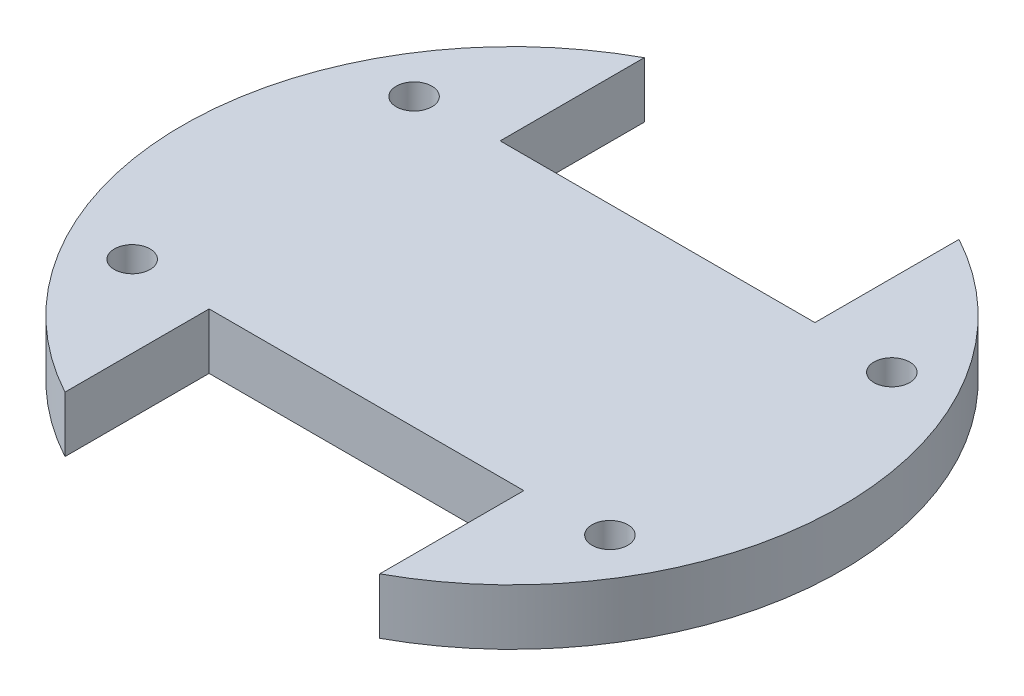
ISO-10303-21;
HEADER;
FILE_DESCRIPTION(('STEP AP214'),'2;1');
FILE_NAME('part.step','',(''),(''),'','','');
FILE_SCHEMA(('AUTOMOTIVE_DESIGN { 1 0 10303 214 1 1 1 1 }'));
ENDSEC;
DATA;
#1=APPLICATION_CONTEXT('core data for automotive mechanical design processes');
#2=APPLICATION_PROTOCOL_DEFINITION('international standard','automotive_design',2000,#1);
#3=PRODUCT_CONTEXT('',#1,'mechanical');
#4=PRODUCT('Part','Part','',(#3));
#5=PRODUCT_RELATED_PRODUCT_CATEGORY('part','',(#4));
#6=PRODUCT_DEFINITION_FORMATION('','',#4);
#7=PRODUCT_DEFINITION_CONTEXT('part definition',#1,'design');
#8=PRODUCT_DEFINITION('design','',#6,#7);
#9=PRODUCT_DEFINITION_SHAPE('','',#8);
#10=(LENGTH_UNIT() NAMED_UNIT(*) SI_UNIT(.MILLI.,.METRE.));
#11=(NAMED_UNIT(*) PLANE_ANGLE_UNIT() SI_UNIT($,.RADIAN.));
#12=(NAMED_UNIT(*) SI_UNIT($,.STERADIAN.) SOLID_ANGLE_UNIT());
#13=UNCERTAINTY_MEASURE_WITH_UNIT(LENGTH_MEASURE(1.E-05),#10,'distance_accuracy_value','');
#14=(GEOMETRIC_REPRESENTATION_CONTEXT(3) GLOBAL_UNCERTAINTY_ASSIGNED_CONTEXT((#13)) GLOBAL_UNIT_ASSIGNED_CONTEXT((#10,
#11,#12)) REPRESENTATION_CONTEXT('',''));
#15=CARTESIAN_POINT('',(0.,0.,0.));
#16=DIRECTION('',(0.,0.,1.));
#17=DIRECTION('',(1.,0.,0.));
#18=AXIS2_PLACEMENT_3D('',#15,#16,#17);
#19=CARTESIAN_POINT('',(0.,5.,0.));
#20=DIRECTION('',(0.,-1.,0.));
#21=DIRECTION('',(0.,0.,-1.));
#22=AXIS2_PLACEMENT_3D('',#19,#20,#21);
#23=CYLINDRICAL_SURFACE('',#22,29.5);
#24=CARTESIAN_POINT('',(0.,0.,0.));
#25=DIRECTION('',(0.,1.,0.));
#26=DIRECTION('',(0.,0.,1.));
#27=AXIS2_PLACEMENT_3D('',#24,#25,#26);
#28=CIRCLE('',#27,29.5);
#29=CARTESIAN_POINT('',(14.0831265655498,0.,25.9213338032345));
#30=VERTEX_POINT('',#29);
#31=CARTESIAN_POINT('',(14.0831265655494,0.,-25.9213338032347));
#32=VERTEX_POINT('',#31);
#33=EDGE_CURVE('E166',#30,#32,#28,.T.);
#34=ORIENTED_EDGE('',*,*,#33,.T.);
#35=DIRECTION('',(0.,-1.,0.));
#36=VECTOR('',#35,1.);
#37=CARTESIAN_POINT('',(14.0831265655494,5.,-25.9213338032347));
#38=LINE('',#37,#36);
#39=CARTESIAN_POINT('',(14.0831265655494,5.,-25.9213338032347));
#40=VERTEX_POINT('',#39);
#41=EDGE_CURVE('E120',#32,#40,#38,.F.);
#42=ORIENTED_EDGE('',*,*,#41,.T.);
#43=CARTESIAN_POINT('',(0.,5.,0.));
#44=DIRECTION('',(0.,1.,0.));
#45=DIRECTION('',(0.,0.,1.));
#46=AXIS2_PLACEMENT_3D('',#43,#44,#45);
#47=CIRCLE('',#46,29.5);
#48=CARTESIAN_POINT('',(14.0831265655498,5.,25.9213338032345));
#49=VERTEX_POINT('',#48);
#50=EDGE_CURVE('E162',#49,#40,#47,.T.);
#51=ORIENTED_EDGE('',*,*,#50,.F.);
#52=DIRECTION('',(0.,-1.,0.));
#53=VECTOR('',#52,1.);
#54=CARTESIAN_POINT('',(14.0831265655498,5.,25.9213338032345));
#55=LINE('',#54,#53);
#56=EDGE_CURVE('E113',#49,#30,#55,.T.);
#57=ORIENTED_EDGE('',*,*,#56,.T.);
#58=EDGE_LOOP('',(#34,#42,#51,#57));
#59=FACE_BOUND('',#58,.T.);
#60=ADVANCED_FACE('F41',(#59),#23,.T.);
#61=CARTESIAN_POINT('',(-14.0831265655494,5.,-25.9213338032347));
#62=VERTEX_POINT('',#61);
#63=CARTESIAN_POINT('',(-14.083126565549,5.,25.9213338032349));
#64=VERTEX_POINT('',#63);
#65=EDGE_CURVE('E165',#62,#64,#47,.T.);
#66=ORIENTED_EDGE('',*,*,#65,.F.);
#67=DIRECTION('',(0.,-1.,0.));
#68=VECTOR('',#67,1.);
#69=CARTESIAN_POINT('',(-14.0831265655494,5.,-25.9213338032347));
#70=LINE('',#69,#68);
#71=CARTESIAN_POINT('',(-14.0831265655494,0.,-25.9213338032347));
#72=VERTEX_POINT('',#71);
#73=EDGE_CURVE('E157',#62,#72,#70,.T.);
#74=ORIENTED_EDGE('',*,*,#73,.T.);
#75=CARTESIAN_POINT('',(-14.083126565549,0.,25.9213338032349));
#76=VERTEX_POINT('',#75);
#77=EDGE_CURVE('E161',#72,#76,#28,.T.);
#78=ORIENTED_EDGE('',*,*,#77,.T.);
#79=DIRECTION('',(0.,-1.,0.));
#80=VECTOR('',#79,1.);
#81=CARTESIAN_POINT('',(-14.083126565549,5.,25.9213338032349));
#82=LINE('',#81,#80);
#83=EDGE_CURVE('E154',#76,#64,#82,.F.);
#84=ORIENTED_EDGE('',*,*,#83,.T.);
#85=EDGE_LOOP('',(#66,#74,#78,#84));
#86=FACE_BOUND('',#85,.T.);
#87=ADVANCED_FACE('F43',(#86),#23,.T.);
#88=CARTESIAN_POINT('',(0.,5.,0.));
#89=DIRECTION('',(0.,1.,0.));
#90=DIRECTION('',(0.,0.,1.));
#91=AXIS2_PLACEMENT_3D('',#88,#89,#90);
#92=PLANE('',#91);
#93=CARTESIAN_POINT('',(21.376,5.,12.613));
#94=DIRECTION('',(0.,1.,0.));
#95=DIRECTION('',(0.,0.,1.));
#96=AXIS2_PLACEMENT_3D('',#93,#94,#95);
#97=CIRCLE('',#96,1.6);
#98=CARTESIAN_POINT('',(21.376,5.,14.213));
#99=VERTEX_POINT('',#98);
#100=EDGE_CURVE('E290',#99,#99,#97,.T.);
#101=ORIENTED_EDGE('',*,*,#100,.F.);
#102=EDGE_LOOP('',(#101));
#103=FACE_BOUND('',#102,.T.);
#104=CARTESIAN_POINT('',(-21.376,5.,12.613));
#105=DIRECTION('',(0.,1.,0.));
#106=DIRECTION('',(0.,0.,1.));
#107=AXIS2_PLACEMENT_3D('',#104,#105,#106);
#108=CIRCLE('',#107,1.6);
#109=CARTESIAN_POINT('',(-21.376,5.,14.213));
#110=VERTEX_POINT('',#109);
#111=EDGE_CURVE('E294',#110,#110,#108,.T.);
#112=ORIENTED_EDGE('',*,*,#111,.F.);
#113=EDGE_LOOP('',(#112));
#114=FACE_BOUND('',#113,.T.);
#115=CARTESIAN_POINT('',(-21.376,5.,-12.613));
#116=DIRECTION('',(0.,1.,0.));
#117=DIRECTION('',(0.,0.,1.));
#118=AXIS2_PLACEMENT_3D('',#115,#116,#117);
#119=CIRCLE('',#118,1.6);
#120=CARTESIAN_POINT('',(-21.376,5.,-11.013));
#121=VERTEX_POINT('',#120);
#122=EDGE_CURVE('E302',#121,#121,#119,.T.);
#123=ORIENTED_EDGE('',*,*,#122,.F.);
#124=EDGE_LOOP('',(#123));
#125=FACE_BOUND('',#124,.T.);
#126=CARTESIAN_POINT('',(21.376,5.,-12.613));
#127=DIRECTION('',(0.,1.,0.));
#128=DIRECTION('',(0.,0.,1.));
#129=AXIS2_PLACEMENT_3D('',#126,#127,#128);
#130=CIRCLE('',#129,1.6);
#131=CARTESIAN_POINT('',(21.376,5.,-11.013));
#132=VERTEX_POINT('',#131);
#133=EDGE_CURVE('E300',#132,#132,#130,.T.);
#134=ORIENTED_EDGE('',*,*,#133,.F.);
#135=EDGE_LOOP('',(#134));
#136=FACE_BOUND('',#135,.T.);
#137=DIRECTION('',(0.,0.,-1.));
#138=VECTOR('',#137,1.);
#139=CARTESIAN_POINT('',(14.0831265655494,5.,-13.0230256450114));
#140=LINE('',#139,#138);
#141=CARTESIAN_POINT('',(14.0831265655494,5.,-13.0230256450114));
#142=VERTEX_POINT('',#141);
#143=EDGE_CURVE('E131',#142,#40,#140,.T.);
#144=ORIENTED_EDGE('',*,*,#143,.F.);
#145=DIRECTION('',(1.,0.,0.));
#146=VECTOR('',#145,1.);
#147=CARTESIAN_POINT('',(-14.0831265655494,5.,-13.0230256450114));
#148=LINE('',#147,#146);
#149=CARTESIAN_POINT('',(-14.0831265655494,5.,-13.0230256450114));
#150=VERTEX_POINT('',#149);
#151=EDGE_CURVE('E110',#150,#142,#148,.T.);
#152=ORIENTED_EDGE('',*,*,#151,.F.);
#153=DIRECTION('',(0.,0.,1.));
#154=VECTOR('',#153,1.);
#155=CARTESIAN_POINT('',(-14.0831265655494,5.,-13.0230256450114));
#156=LINE('',#155,#154);
#157=EDGE_CURVE('E133',#62,#150,#156,.T.);
#158=ORIENTED_EDGE('',*,*,#157,.F.);
#159=ORIENTED_EDGE('',*,*,#65,.T.);
#160=DIRECTION('',(0.,0.,1.));
#161=VECTOR('',#160,1.);
#162=CARTESIAN_POINT('',(-14.0831265655486,5.,13.0230256450114));
#163=LINE('',#162,#161);
#164=CARTESIAN_POINT('',(-14.0831265655486,5.,13.0230256450114));
#165=VERTEX_POINT('',#164);
#166=EDGE_CURVE('E143',#165,#64,#163,.T.);
#167=ORIENTED_EDGE('',*,*,#166,.F.);
#168=DIRECTION('',(-1.,0.,0.));
#169=VECTOR('',#168,1.);
#170=CARTESIAN_POINT('',(14.0831265655501,5.,13.0230256450114));
#171=LINE('',#170,#169);
#172=CARTESIAN_POINT('',(14.0831265655501,5.,13.0230256450114));
#173=VERTEX_POINT('',#172);
#174=EDGE_CURVE('E145',#173,#165,#171,.T.);
#175=ORIENTED_EDGE('',*,*,#174,.F.);
#176=DIRECTION('',(0.,0.,-1.));
#177=VECTOR('',#176,1.);
#178=CARTESIAN_POINT('',(14.0831265655501,5.,13.0230256450114));
#179=LINE('',#178,#177);
#180=EDGE_CURVE('E134',#49,#173,#179,.T.);
#181=ORIENTED_EDGE('',*,*,#180,.F.);
#182=ORIENTED_EDGE('',*,*,#50,.T.);
#183=EDGE_LOOP('',(#144,#152,#158,#159,#167,#175,#181,#182));
#184=FACE_BOUND('',#183,.T.);
#185=ADVANCED_FACE('F174',(#103,#114,#125,#136,#184),#92,.T.);
#186=CARTESIAN_POINT('',(0.,0.,0.));
#187=DIRECTION('',(0.,1.,0.));
#188=DIRECTION('',(0.,0.,1.));
#189=AXIS2_PLACEMENT_3D('',#186,#187,#188);
#190=PLANE('',#189);
#191=CARTESIAN_POINT('',(21.376,0.,12.613));
#192=DIRECTION('',(0.,1.,0.));
#193=DIRECTION('',(0.,0.,1.));
#194=AXIS2_PLACEMENT_3D('',#191,#192,#193);
#195=CIRCLE('',#194,1.6);
#196=CARTESIAN_POINT('',(21.376,0.,14.213));
#197=VERTEX_POINT('',#196);
#198=EDGE_CURVE('E288',#197,#197,#195,.T.);
#199=ORIENTED_EDGE('',*,*,#198,.T.);
#200=EDGE_LOOP('',(#199));
#201=FACE_BOUND('',#200,.T.);
#202=CARTESIAN_POINT('',(-21.376,0.,12.613));
#203=DIRECTION('',(0.,1.,0.));
#204=DIRECTION('',(0.,0.,1.));
#205=AXIS2_PLACEMENT_3D('',#202,#203,#204);
#206=CIRCLE('',#205,1.6);
#207=CARTESIAN_POINT('',(-21.376,0.,14.213));
#208=VERTEX_POINT('',#207);
#209=EDGE_CURVE('E291',#208,#208,#206,.T.);
#210=ORIENTED_EDGE('',*,*,#209,.T.);
#211=EDGE_LOOP('',(#210));
#212=FACE_BOUND('',#211,.T.);
#213=CARTESIAN_POINT('',(-21.376,0.,-12.613));
#214=DIRECTION('',(0.,1.,0.));
#215=DIRECTION('',(0.,0.,1.));
#216=AXIS2_PLACEMENT_3D('',#213,#214,#215);
#217=CIRCLE('',#216,1.6);
#218=CARTESIAN_POINT('',(-21.376,0.,-11.013));
#219=VERTEX_POINT('',#218);
#220=EDGE_CURVE('E306',#219,#219,#217,.T.);
#221=ORIENTED_EDGE('',*,*,#220,.T.);
#222=EDGE_LOOP('',(#221));
#223=FACE_BOUND('',#222,.T.);
#224=CARTESIAN_POINT('',(21.376,0.,-12.613));
#225=DIRECTION('',(0.,1.,0.));
#226=DIRECTION('',(0.,0.,1.));
#227=AXIS2_PLACEMENT_3D('',#224,#225,#226);
#228=CIRCLE('',#227,1.6);
#229=CARTESIAN_POINT('',(21.376,0.,-11.013));
#230=VERTEX_POINT('',#229);
#231=EDGE_CURVE('E142',#230,#230,#228,.T.);
#232=ORIENTED_EDGE('',*,*,#231,.T.);
#233=EDGE_LOOP('',(#232));
#234=FACE_BOUND('',#233,.T.);
#235=DIRECTION('',(1.,0.,0.));
#236=VECTOR('',#235,1.);
#237=CARTESIAN_POINT('',(-14.0831265655494,0.,-13.0230256450114));
#238=LINE('',#237,#236);
#239=CARTESIAN_POINT('',(-14.0831265655494,0.,-13.0230256450114));
#240=VERTEX_POINT('',#239);
#241=CARTESIAN_POINT('',(14.0831265655494,0.,-13.0230256450114));
#242=VERTEX_POINT('',#241);
#243=EDGE_CURVE('E56',#240,#242,#238,.T.);
#244=ORIENTED_EDGE('',*,*,#243,.T.);
#245=DIRECTION('',(0.,0.,-1.));
#246=VECTOR('',#245,1.);
#247=CARTESIAN_POINT('',(14.0831265655494,0.,-13.0230256450114));
#248=LINE('',#247,#246);
#249=EDGE_CURVE('E117',#242,#32,#248,.T.);
#250=ORIENTED_EDGE('',*,*,#249,.T.);
#251=ORIENTED_EDGE('',*,*,#33,.F.);
#252=DIRECTION('',(0.,0.,-1.));
#253=VECTOR('',#252,1.);
#254=CARTESIAN_POINT('',(14.0831265655505,0.,3.80311310732279E-13));
#255=LINE('',#254,#253);
#256=CARTESIAN_POINT('',(14.0831265655501,0.,13.0230256450114));
#257=VERTEX_POINT('',#256);
#258=EDGE_CURVE('E49',#30,#257,#255,.T.);
#259=ORIENTED_EDGE('',*,*,#258,.T.);
#260=DIRECTION('',(-1.,0.,0.));
#261=VECTOR('',#260,1.);
#262=CARTESIAN_POINT('',(14.0831265655501,0.,13.0230256450114));
#263=LINE('',#262,#261);
#264=CARTESIAN_POINT('',(-14.0831265655486,0.,13.0230256450114));
#265=VERTEX_POINT('',#264);
#266=EDGE_CURVE('E64',#257,#265,#263,.T.);
#267=ORIENTED_EDGE('',*,*,#266,.T.);
#268=DIRECTION('',(0.,0.,1.));
#269=VECTOR('',#268,1.);
#270=CARTESIAN_POINT('',(-14.0831265655486,0.,13.0230256450114));
#271=LINE('',#270,#269);
#272=EDGE_CURVE('E139',#265,#76,#271,.T.);
#273=ORIENTED_EDGE('',*,*,#272,.T.);
#274=ORIENTED_EDGE('',*,*,#77,.F.);
#275=DIRECTION('',(0.,0.,1.));
#276=VECTOR('',#275,1.);
#277=CARTESIAN_POINT('',(-14.0831265655494,0.,0.));
#278=LINE('',#277,#276);
#279=EDGE_CURVE('E11',#72,#240,#278,.T.);
#280=ORIENTED_EDGE('',*,*,#279,.T.);
#281=EDGE_LOOP('',(#244,#250,#251,#259,#267,#273,#274,#280));
#282=FACE_BOUND('',#281,.T.);
#283=ADVANCED_FACE('F125',(#201,#212,#223,#234,#282),#190,.F.);
#284=CARTESIAN_POINT('',(-14.0831265655486,0.,13.0230256450114));
#285=DIRECTION('',(-1.,0.,0.));
#286=DIRECTION('',(0.,0.,1.));
#287=AXIS2_PLACEMENT_3D('',#284,#285,#286);
#288=PLANE('',#287);
#289=ORIENTED_EDGE('',*,*,#272,.F.);
#290=DIRECTION('',(0.,1.,0.));
#291=VECTOR('',#290,1.);
#292=CARTESIAN_POINT('',(-14.0831265655486,0.,13.0230256450114));
#293=LINE('',#292,#291);
#294=EDGE_CURVE('E140',#265,#165,#293,.T.);
#295=ORIENTED_EDGE('',*,*,#294,.T.);
#296=ORIENTED_EDGE('',*,*,#166,.T.);
#297=ORIENTED_EDGE('',*,*,#83,.F.);
#298=EDGE_LOOP('',(#289,#295,#296,#297));
#299=FACE_BOUND('',#298,.T.);
#300=ADVANCED_FACE('F183',(#299),#288,.F.);
#301=CARTESIAN_POINT('',(14.0831265655501,0.,13.0230256450114));
#302=DIRECTION('',(1.,0.,0.));
#303=DIRECTION('',(0.,0.,-1.));
#304=AXIS2_PLACEMENT_3D('',#301,#302,#303);
#305=PLANE('',#304);
#306=ORIENTED_EDGE('',*,*,#180,.T.);
#307=DIRECTION('',(0.,1.,0.));
#308=VECTOR('',#307,1.);
#309=CARTESIAN_POINT('',(14.0831265655501,0.,13.0230256450114));
#310=LINE('',#309,#308);
#311=EDGE_CURVE('E137',#257,#173,#310,.T.);
#312=ORIENTED_EDGE('',*,*,#311,.F.);
#313=ORIENTED_EDGE('',*,*,#258,.F.);
#314=ORIENTED_EDGE('',*,*,#56,.F.);
#315=EDGE_LOOP('',(#306,#312,#313,#314));
#316=FACE_BOUND('',#315,.T.);
#317=ADVANCED_FACE('F169',(#316),#305,.F.);
#318=CARTESIAN_POINT('',(14.0831265655501,0.,13.0230256450114));
#319=DIRECTION('',(0.,0.,-1.));
#320=DIRECTION('',(-1.,0.,0.));
#321=AXIS2_PLACEMENT_3D('',#318,#319,#320);
#322=PLANE('',#321);
#323=ORIENTED_EDGE('',*,*,#174,.T.);
#324=ORIENTED_EDGE('',*,*,#294,.F.);
#325=ORIENTED_EDGE('',*,*,#266,.F.);
#326=ORIENTED_EDGE('',*,*,#311,.T.);
#327=EDGE_LOOP('',(#323,#324,#325,#326));
#328=FACE_BOUND('',#327,.T.);
#329=ADVANCED_FACE('F177',(#328),#322,.F.);
#330=CARTESIAN_POINT('',(14.0831265655494,0.,-13.0230256450114));
#331=DIRECTION('',(1.,0.,0.));
#332=DIRECTION('',(0.,0.,-1.));
#333=AXIS2_PLACEMENT_3D('',#330,#331,#332);
#334=PLANE('',#333);
#335=ORIENTED_EDGE('',*,*,#249,.F.);
#336=DIRECTION('',(0.,1.,0.));
#337=VECTOR('',#336,1.);
#338=CARTESIAN_POINT('',(14.0831265655494,0.,-13.0230256450114));
#339=LINE('',#338,#337);
#340=EDGE_CURVE('E106',#242,#142,#339,.T.);
#341=ORIENTED_EDGE('',*,*,#340,.T.);
#342=ORIENTED_EDGE('',*,*,#143,.T.);
#343=ORIENTED_EDGE('',*,*,#41,.F.);
#344=EDGE_LOOP('',(#335,#341,#342,#343));
#345=FACE_BOUND('',#344,.T.);
#346=ADVANCED_FACE('F118',(#345),#334,.F.);
#347=CARTESIAN_POINT('',(-14.0831265655494,0.,-13.0230256450114));
#348=DIRECTION('',(-1.,0.,0.));
#349=DIRECTION('',(0.,0.,1.));
#350=AXIS2_PLACEMENT_3D('',#347,#348,#349);
#351=PLANE('',#350);
#352=ORIENTED_EDGE('',*,*,#157,.T.);
#353=DIRECTION('',(0.,1.,0.));
#354=VECTOR('',#353,1.);
#355=CARTESIAN_POINT('',(-14.0831265655494,0.,-13.0230256450114));
#356=LINE('',#355,#354);
#357=EDGE_CURVE('E114',#240,#150,#356,.T.);
#358=ORIENTED_EDGE('',*,*,#357,.F.);
#359=ORIENTED_EDGE('',*,*,#279,.F.);
#360=ORIENTED_EDGE('',*,*,#73,.F.);
#361=EDGE_LOOP('',(#352,#358,#359,#360));
#362=FACE_BOUND('',#361,.T.);
#363=ADVANCED_FACE('F187',(#362),#351,.F.);
#364=CARTESIAN_POINT('',(-14.0831265655494,0.,-13.0230256450114));
#365=DIRECTION('',(0.,0.,1.));
#366=DIRECTION('',(1.,0.,0.));
#367=AXIS2_PLACEMENT_3D('',#364,#365,#366);
#368=PLANE('',#367);
#369=ORIENTED_EDGE('',*,*,#151,.T.);
#370=ORIENTED_EDGE('',*,*,#340,.F.);
#371=ORIENTED_EDGE('',*,*,#243,.F.);
#372=ORIENTED_EDGE('',*,*,#357,.T.);
#373=EDGE_LOOP('',(#369,#370,#371,#372));
#374=FACE_BOUND('',#373,.T.);
#375=ADVANCED_FACE('F108',(#374),#368,.F.);
#376=CARTESIAN_POINT('',(21.376,0.,-12.613));
#377=DIRECTION('',(0.,1.,0.));
#378=DIRECTION('',(0.,0.,1.));
#379=AXIS2_PLACEMENT_3D('',#376,#377,#378);
#380=CYLINDRICAL_SURFACE('',#379,1.6);
#381=ORIENTED_EDGE('',*,*,#231,.F.);
#382=EDGE_LOOP('',(#381));
#383=FACE_BOUND('',#382,.T.);
#384=ORIENTED_EDGE('',*,*,#133,.T.);
#385=EDGE_LOOP('',(#384));
#386=FACE_BOUND('',#385,.T.);
#387=ADVANCED_FACE('F194',(#383,#386),#380,.F.);
#388=CARTESIAN_POINT('',(-21.376,0.,-12.613));
#389=DIRECTION('',(0.,1.,0.));
#390=DIRECTION('',(0.,0.,1.));
#391=AXIS2_PLACEMENT_3D('',#388,#389,#390);
#392=CYLINDRICAL_SURFACE('',#391,1.6);
#393=ORIENTED_EDGE('',*,*,#220,.F.);
#394=EDGE_LOOP('',(#393));
#395=FACE_BOUND('',#394,.T.);
#396=ORIENTED_EDGE('',*,*,#122,.T.);
#397=EDGE_LOOP('',(#396));
#398=FACE_BOUND('',#397,.T.);
#399=ADVANCED_FACE('F252',(#395,#398),#392,.F.);
#400=CARTESIAN_POINT('',(-21.376,0.,12.613));
#401=DIRECTION('',(0.,1.,0.));
#402=DIRECTION('',(0.,0.,1.));
#403=AXIS2_PLACEMENT_3D('',#400,#401,#402);
#404=CYLINDRICAL_SURFACE('',#403,1.6);
#405=ORIENTED_EDGE('',*,*,#209,.F.);
#406=EDGE_LOOP('',(#405));
#407=FACE_BOUND('',#406,.T.);
#408=ORIENTED_EDGE('',*,*,#111,.T.);
#409=EDGE_LOOP('',(#408));
#410=FACE_BOUND('',#409,.T.);
#411=ADVANCED_FACE('F262',(#407,#410),#404,.F.);
#412=CARTESIAN_POINT('',(21.376,0.,12.613));
#413=DIRECTION('',(0.,1.,0.));
#414=DIRECTION('',(0.,0.,1.));
#415=AXIS2_PLACEMENT_3D('',#412,#413,#414);
#416=CYLINDRICAL_SURFACE('',#415,1.6);
#417=ORIENTED_EDGE('',*,*,#198,.F.);
#418=EDGE_LOOP('',(#417));
#419=FACE_BOUND('',#418,.T.);
#420=ORIENTED_EDGE('',*,*,#100,.T.);
#421=EDGE_LOOP('',(#420));
#422=FACE_BOUND('',#421,.T.);
#423=ADVANCED_FACE('F272',(#419,#422),#416,.F.);
#424=CLOSED_SHELL('',(#60,#87,#185,#283,#300,#317,#329,#346,#363,#375,#387,#399,#411,#423));
#425=MANIFOLD_SOLID_BREP('B2',#424);
#426=ADVANCED_BREP_SHAPE_REPRESENTATION('',(#18,#425),#14);
#427=SHAPE_DEFINITION_REPRESENTATION(#9,#426);
ENDSEC;
END-ISO-10303-21;
